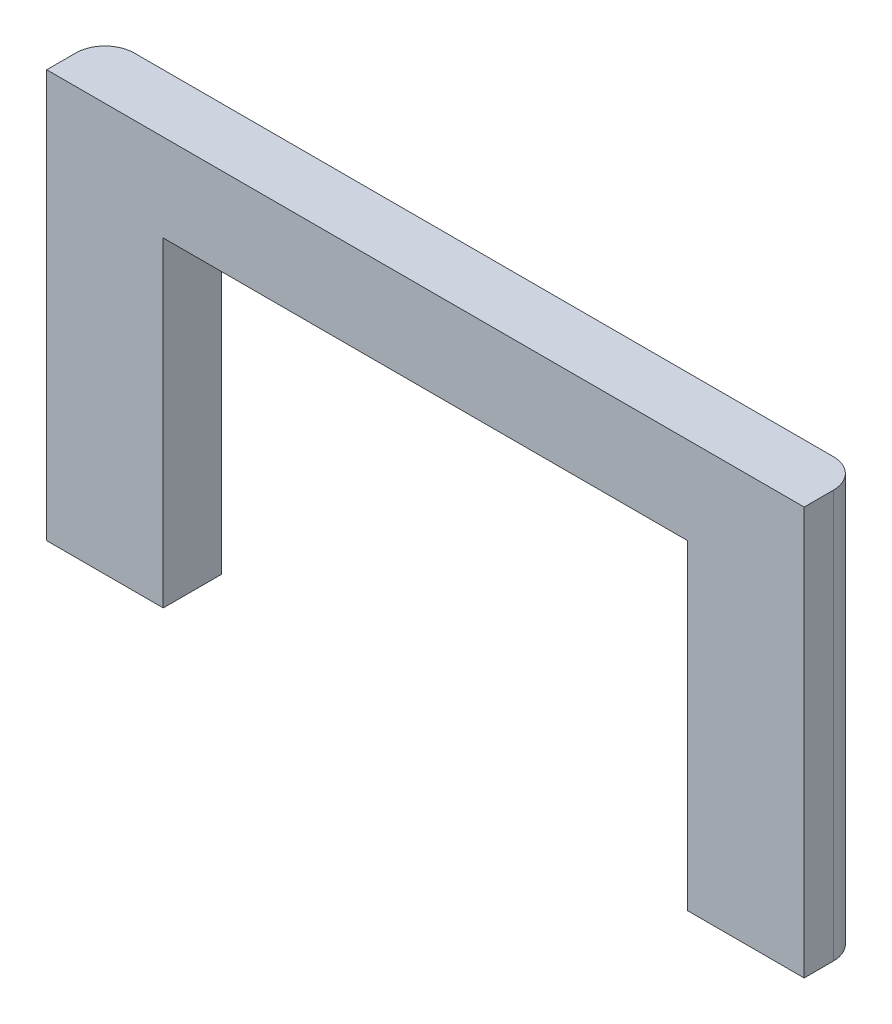
ISO-10303-21;
HEADER;
FILE_DESCRIPTION(('STEP AP214'),'2;1');
FILE_NAME('part.step','',(''),(''),'','','');
FILE_SCHEMA(('AUTOMOTIVE_DESIGN { 1 0 10303 214 1 1 1 1 }'));
ENDSEC;
DATA;
#1=APPLICATION_CONTEXT('core data for automotive mechanical design processes');
#2=APPLICATION_PROTOCOL_DEFINITION('international standard','automotive_design',2000,#1);
#3=PRODUCT_CONTEXT('',#1,'mechanical');
#4=PRODUCT('Part','Part','',(#3));
#5=PRODUCT_RELATED_PRODUCT_CATEGORY('part','',(#4));
#6=PRODUCT_DEFINITION_FORMATION('','',#4);
#7=PRODUCT_DEFINITION_CONTEXT('part definition',#1,'design');
#8=PRODUCT_DEFINITION('design','',#6,#7);
#9=PRODUCT_DEFINITION_SHAPE('','',#8);
#10=(LENGTH_UNIT() NAMED_UNIT(*) SI_UNIT(.MILLI.,.METRE.));
#11=(NAMED_UNIT(*) PLANE_ANGLE_UNIT() SI_UNIT($,.RADIAN.));
#12=(NAMED_UNIT(*) SI_UNIT($,.STERADIAN.) SOLID_ANGLE_UNIT());
#13=UNCERTAINTY_MEASURE_WITH_UNIT(LENGTH_MEASURE(1.E-05),#10,'distance_accuracy_value','');
#14=(GEOMETRIC_REPRESENTATION_CONTEXT(3) GLOBAL_UNCERTAINTY_ASSIGNED_CONTEXT((#13)) GLOBAL_UNIT_ASSIGNED_CONTEXT((#10,
#11,#12)) REPRESENTATION_CONTEXT('',''));
#15=CARTESIAN_POINT('',(0.,0.,0.));
#16=DIRECTION('',(0.,0.,1.));
#17=DIRECTION('',(1.,0.,0.));
#18=AXIS2_PLACEMENT_3D('',#15,#16,#17);
#19=CARTESIAN_POINT('',(-83.3039647577092,29.9118942731278,10.));
#20=DIRECTION('',(1.,0.,0.));
#21=DIRECTION('',(0.,0.,-1.));
#22=AXIS2_PLACEMENT_3D('',#19,#20,#21);
#23=PLANE('',#22);
#24=DIRECTION('',(0.,0.,-1.));
#25=VECTOR('',#24,1.);
#26=CARTESIAN_POINT('',(-83.3039647577092,29.9118942731278,10.));
#27=LINE('',#26,#25);
#28=CARTESIAN_POINT('',(-83.3039647577092,29.9118942731278,10.));
#29=VERTEX_POINT('',#28);
#30=CARTESIAN_POINT('',(-83.3039647577092,29.9118942731278,5.));
#31=VERTEX_POINT('',#30);
#32=EDGE_CURVE('E201',#29,#31,#27,.T.);
#33=ORIENTED_EDGE('',*,*,#32,.T.);
#34=DIRECTION('',(0.,-1.,0.));
#35=VECTOR('',#34,1.);
#36=CARTESIAN_POINT('',(-83.3039647577092,29.9118942731278,5.));
#37=LINE('',#36,#35);
#38=CARTESIAN_POINT('',(-83.3039647577092,-40.0881057268723,5.));
#39=VERTEX_POINT('',#38);
#40=EDGE_CURVE('E48',#31,#39,#37,.T.);
#41=ORIENTED_EDGE('',*,*,#40,.T.);
#42=DIRECTION('',(0.,0.,-1.));
#43=VECTOR('',#42,1.);
#44=CARTESIAN_POINT('',(-83.3039647577092,-40.0881057268723,10.));
#45=LINE('',#44,#43);
#46=CARTESIAN_POINT('',(-83.3039647577092,-40.0881057268723,10.));
#47=VERTEX_POINT('',#46);
#48=EDGE_CURVE('E117',#47,#39,#45,.T.);
#49=ORIENTED_EDGE('',*,*,#48,.F.);
#50=DIRECTION('',(0.,-1.,0.));
#51=VECTOR('',#50,1.);
#52=CARTESIAN_POINT('',(-83.3039647577092,29.9118942731278,10.));
#53=LINE('',#52,#51);
#54=EDGE_CURVE('E124',#29,#47,#53,.T.);
#55=ORIENTED_EDGE('',*,*,#54,.F.);
#56=EDGE_LOOP('',(#33,#41,#49,#55));
#57=FACE_BOUND('',#56,.T.);
#58=ADVANCED_FACE('F39',(#57),#23,.F.);
#59=CARTESIAN_POINT('',(-83.3039647577092,-40.0881057268723,10.));
#60=DIRECTION('',(0.,1.,0.));
#61=DIRECTION('',(0.,0.,1.));
#62=AXIS2_PLACEMENT_3D('',#59,#60,#61);
#63=PLANE('',#62);
#64=ORIENTED_EDGE('',*,*,#48,.T.);
#65=CARTESIAN_POINT('',(-78.3039647577092,-40.0881057268723,5.));
#66=DIRECTION('',(0.,1.,0.));
#67=DIRECTION('',(0.,0.,1.));
#68=AXIS2_PLACEMENT_3D('',#65,#66,#67);
#69=CIRCLE('',#68,5.);
#70=CARTESIAN_POINT('',(-78.3039647577092,-40.0881057268723,0.));
#71=VERTEX_POINT('',#70);
#72=EDGE_CURVE('E11',#39,#71,#69,.F.);
#73=ORIENTED_EDGE('',*,*,#72,.T.);
#74=DIRECTION('',(1.,0.,0.));
#75=VECTOR('',#74,1.);
#76=CARTESIAN_POINT('',(-83.3039647577092,-40.0881057268723,0.));
#77=LINE('',#76,#75);
#78=CARTESIAN_POINT('',(-63.3039647577092,-40.0881057268723,0.));
#79=VERTEX_POINT('',#78);
#80=EDGE_CURVE('E229',#71,#79,#77,.T.);
#81=ORIENTED_EDGE('',*,*,#80,.T.);
#82=DIRECTION('',(0.,0.,-1.));
#83=VECTOR('',#82,1.);
#84=CARTESIAN_POINT('',(-63.3039647577092,-40.0881057268723,10.));
#85=LINE('',#84,#83);
#86=CARTESIAN_POINT('',(-63.3039647577092,-40.0881057268723,10.));
#87=VERTEX_POINT('',#86);
#88=EDGE_CURVE('E119',#87,#79,#85,.T.);
#89=ORIENTED_EDGE('',*,*,#88,.F.);
#90=DIRECTION('',(1.,0.,0.));
#91=VECTOR('',#90,1.);
#92=CARTESIAN_POINT('',(-83.3039647577092,-40.0881057268723,10.));
#93=LINE('',#92,#91);
#94=EDGE_CURVE('E113',#47,#87,#93,.T.);
#95=ORIENTED_EDGE('',*,*,#94,.F.);
#96=EDGE_LOOP('',(#64,#73,#81,#89,#95));
#97=FACE_BOUND('',#96,.T.);
#98=ADVANCED_FACE('F115',(#97),#63,.F.);
#99=CARTESIAN_POINT('',(-63.3039647577092,14.9118942731278,10.));
#100=DIRECTION('',(-1.,0.,0.));
#101=DIRECTION('',(0.,-1.,0.));
#102=AXIS2_PLACEMENT_3D('',#99,#100,#101);
#103=PLANE('',#102);
#104=DIRECTION('',(0.,1.,0.));
#105=VECTOR('',#104,1.);
#106=CARTESIAN_POINT('',(-63.3039647577092,14.9118942731278,0.));
#107=LINE('',#106,#105);
#108=CARTESIAN_POINT('',(-63.3039647577092,14.9118942731278,0.));
#109=VERTEX_POINT('',#108);
#110=EDGE_CURVE('E224',#79,#109,#107,.T.);
#111=ORIENTED_EDGE('',*,*,#110,.T.);
#112=DIRECTION('',(0.,0.,-1.));
#113=VECTOR('',#112,1.);
#114=CARTESIAN_POINT('',(-63.3039647577092,14.9118942731278,10.));
#115=LINE('',#114,#113);
#116=CARTESIAN_POINT('',(-63.3039647577092,14.9118942731278,10.));
#117=VERTEX_POINT('',#116);
#118=EDGE_CURVE('E144',#117,#109,#115,.T.);
#119=ORIENTED_EDGE('',*,*,#118,.F.);
#120=DIRECTION('',(0.,1.,0.));
#121=VECTOR('',#120,1.);
#122=CARTESIAN_POINT('',(-63.3039647577092,14.9118942731278,10.));
#123=LINE('',#122,#121);
#124=EDGE_CURVE('E123',#87,#117,#123,.T.);
#125=ORIENTED_EDGE('',*,*,#124,.F.);
#126=ORIENTED_EDGE('',*,*,#88,.T.);
#127=EDGE_LOOP('',(#111,#119,#125,#126));
#128=FACE_BOUND('',#127,.T.);
#129=ADVANCED_FACE('F247',(#128),#103,.F.);
#130=CARTESIAN_POINT('',(-63.3039647577092,14.9118942731278,10.));
#131=DIRECTION('',(0.,1.,0.));
#132=DIRECTION('',(0.,0.,1.));
#133=AXIS2_PLACEMENT_3D('',#130,#131,#132);
#134=PLANE('',#133);
#135=DIRECTION('',(1.,0.,0.));
#136=VECTOR('',#135,1.);
#137=CARTESIAN_POINT('',(-63.3039647577092,14.9118942731278,0.));
#138=LINE('',#137,#136);
#139=CARTESIAN_POINT('',(26.6960352422908,14.9118942731278,0.));
#140=VERTEX_POINT('',#139);
#141=EDGE_CURVE('E219',#109,#140,#138,.T.);
#142=ORIENTED_EDGE('',*,*,#141,.T.);
#143=DIRECTION('',(0.,0.,-1.));
#144=VECTOR('',#143,1.);
#145=CARTESIAN_POINT('',(26.6960352422908,14.9118942731278,10.));
#146=LINE('',#145,#144);
#147=CARTESIAN_POINT('',(26.6960352422908,14.9118942731278,10.));
#148=VERTEX_POINT('',#147);
#149=EDGE_CURVE('E208',#148,#140,#146,.T.);
#150=ORIENTED_EDGE('',*,*,#149,.F.);
#151=DIRECTION('',(1.,0.,0.));
#152=VECTOR('',#151,1.);
#153=CARTESIAN_POINT('',(-63.3039647577092,14.9118942731278,10.));
#154=LINE('',#153,#152);
#155=EDGE_CURVE('E220',#117,#148,#154,.T.);
#156=ORIENTED_EDGE('',*,*,#155,.F.);
#157=ORIENTED_EDGE('',*,*,#118,.T.);
#158=EDGE_LOOP('',(#142,#150,#156,#157));
#159=FACE_BOUND('',#158,.T.);
#160=ADVANCED_FACE('F217',(#159),#134,.F.);
#161=CARTESIAN_POINT('',(26.6960352422908,14.9118942731278,10.));
#162=DIRECTION('',(1.,0.,0.));
#163=DIRECTION('',(0.,0.,-1.));
#164=AXIS2_PLACEMENT_3D('',#161,#162,#163);
#165=PLANE('',#164);
#166=DIRECTION('',(0.,-1.,0.));
#167=VECTOR('',#166,1.);
#168=CARTESIAN_POINT('',(26.6960352422908,14.9118942731278,0.));
#169=LINE('',#168,#167);
#170=CARTESIAN_POINT('',(26.6960352422908,-40.0881057268723,0.));
#171=VERTEX_POINT('',#170);
#172=EDGE_CURVE('E197',#140,#171,#169,.T.);
#173=ORIENTED_EDGE('',*,*,#172,.T.);
#174=DIRECTION('',(0.,0.,-1.));
#175=VECTOR('',#174,1.);
#176=CARTESIAN_POINT('',(26.6960352422908,-40.0881057268723,10.));
#177=LINE('',#176,#175);
#178=CARTESIAN_POINT('',(26.6960352422908,-40.0881057268723,10.));
#179=VERTEX_POINT('',#178);
#180=EDGE_CURVE('E183',#179,#171,#177,.T.);
#181=ORIENTED_EDGE('',*,*,#180,.F.);
#182=DIRECTION('',(0.,-1.,0.));
#183=VECTOR('',#182,1.);
#184=CARTESIAN_POINT('',(26.6960352422908,14.9118942731278,10.));
#185=LINE('',#184,#183);
#186=EDGE_CURVE('E241',#148,#179,#185,.T.);
#187=ORIENTED_EDGE('',*,*,#186,.F.);
#188=ORIENTED_EDGE('',*,*,#149,.T.);
#189=EDGE_LOOP('',(#173,#181,#187,#188));
#190=FACE_BOUND('',#189,.T.);
#191=ADVANCED_FACE('F254',(#190),#165,.F.);
#192=CARTESIAN_POINT('',(26.6960352422908,-40.0881057268723,10.));
#193=DIRECTION('',(0.,1.,0.));
#194=DIRECTION('',(0.,0.,1.));
#195=AXIS2_PLACEMENT_3D('',#192,#193,#194);
#196=PLANE('',#195);
#197=DIRECTION('',(1.,0.,0.));
#198=VECTOR('',#197,1.);
#199=CARTESIAN_POINT('',(26.6960352422908,-40.0881057268723,0.));
#200=LINE('',#199,#198);
#201=CARTESIAN_POINT('',(41.6960352422908,-40.0881057268723,0.));
#202=VERTEX_POINT('',#201);
#203=EDGE_CURVE('E173',#171,#202,#200,.T.);
#204=ORIENTED_EDGE('',*,*,#203,.T.);
#205=CARTESIAN_POINT('',(41.6960352422908,-40.0881057268723,5.));
#206=DIRECTION('',(0.,1.,0.));
#207=DIRECTION('',(0.,0.,1.));
#208=AXIS2_PLACEMENT_3D('',#205,#206,#207);
#209=CIRCLE('',#208,5.);
#210=CARTESIAN_POINT('',(46.6960352422908,-40.0881057268723,5.));
#211=VERTEX_POINT('',#210);
#212=EDGE_CURVE('E159',#202,#211,#209,.F.);
#213=ORIENTED_EDGE('',*,*,#212,.T.);
#214=DIRECTION('',(0.,0.,-1.));
#215=VECTOR('',#214,1.);
#216=CARTESIAN_POINT('',(46.6960352422908,-40.0881057268723,10.));
#217=LINE('',#216,#215);
#218=CARTESIAN_POINT('',(46.6960352422908,-40.0881057268723,10.));
#219=VERTEX_POINT('',#218);
#220=EDGE_CURVE('E169',#219,#211,#217,.T.);
#221=ORIENTED_EDGE('',*,*,#220,.F.);
#222=DIRECTION('',(1.,0.,0.));
#223=VECTOR('',#222,1.);
#224=CARTESIAN_POINT('',(26.6960352422908,-40.0881057268723,10.));
#225=LINE('',#224,#223);
#226=EDGE_CURVE('E238',#179,#219,#225,.T.);
#227=ORIENTED_EDGE('',*,*,#226,.F.);
#228=ORIENTED_EDGE('',*,*,#180,.T.);
#229=EDGE_LOOP('',(#204,#213,#221,#227,#228));
#230=FACE_BOUND('',#229,.T.);
#231=ADVANCED_FACE('F167',(#230),#196,.F.);
#232=CARTESIAN_POINT('',(46.6960352422908,29.9118942731278,10.));
#233=DIRECTION('',(-1.,0.,0.));
#234=DIRECTION('',(0.,-1.,0.));
#235=AXIS2_PLACEMENT_3D('',#232,#233,#234);
#236=PLANE('',#235);
#237=ORIENTED_EDGE('',*,*,#220,.T.);
#238=DIRECTION('',(0.,1.,0.));
#239=VECTOR('',#238,1.);
#240=CARTESIAN_POINT('',(46.6960352422908,29.9118942731278,5.));
#241=LINE('',#240,#239);
#242=CARTESIAN_POINT('',(46.6960352422908,29.9118942731278,5.));
#243=VERTEX_POINT('',#242);
#244=EDGE_CURVE('E137',#211,#243,#241,.T.);
#245=ORIENTED_EDGE('',*,*,#244,.T.);
#246=DIRECTION('',(0.,0.,-1.));
#247=VECTOR('',#246,1.);
#248=CARTESIAN_POINT('',(46.6960352422908,29.9118942731278,10.));
#249=LINE('',#248,#247);
#250=CARTESIAN_POINT('',(46.6960352422908,29.9118942731278,10.));
#251=VERTEX_POINT('',#250);
#252=EDGE_CURVE('E184',#251,#243,#249,.T.);
#253=ORIENTED_EDGE('',*,*,#252,.F.);
#254=DIRECTION('',(0.,1.,0.));
#255=VECTOR('',#254,1.);
#256=CARTESIAN_POINT('',(46.6960352422908,29.9118942731278,10.));
#257=LINE('',#256,#255);
#258=EDGE_CURVE('E181',#219,#251,#257,.T.);
#259=ORIENTED_EDGE('',*,*,#258,.F.);
#260=EDGE_LOOP('',(#237,#245,#253,#259));
#261=FACE_BOUND('',#260,.T.);
#262=ADVANCED_FACE('F178',(#261),#236,.F.);
#263=CARTESIAN_POINT('',(-83.3039647577092,29.9118942731278,10.));
#264=DIRECTION('',(0.,-1.,0.));
#265=DIRECTION('',(0.,0.,-1.));
#266=AXIS2_PLACEMENT_3D('',#263,#264,#265);
#267=PLANE('',#266);
#268=ORIENTED_EDGE('',*,*,#252,.T.);
#269=CARTESIAN_POINT('',(41.6960352422908,29.9118942731278,5.));
#270=DIRECTION('',(0.,-1.,0.));
#271=DIRECTION('',(0.,0.,-1.));
#272=AXIS2_PLACEMENT_3D('',#269,#270,#271);
#273=CIRCLE('',#272,5.);
#274=CARTESIAN_POINT('',(41.6960352422908,29.9118942731278,0.));
#275=VERTEX_POINT('',#274);
#276=EDGE_CURVE('E150',#243,#275,#273,.F.);
#277=ORIENTED_EDGE('',*,*,#276,.T.);
#278=DIRECTION('',(-1.,0.,0.));
#279=VECTOR('',#278,1.);
#280=CARTESIAN_POINT('',(-83.3039647577092,29.9118942731278,0.));
#281=LINE('',#280,#279);
#282=CARTESIAN_POINT('',(-78.3039647577092,29.9118942731278,0.));
#283=VERTEX_POINT('',#282);
#284=EDGE_CURVE('E134',#275,#283,#281,.T.);
#285=ORIENTED_EDGE('',*,*,#284,.T.);
#286=CARTESIAN_POINT('',(-78.3039647577092,29.9118942731278,5.));
#287=DIRECTION('',(0.,-1.,0.));
#288=DIRECTION('',(0.,0.,-1.));
#289=AXIS2_PLACEMENT_3D('',#286,#287,#288);
#290=CIRCLE('',#289,5.);
#291=EDGE_CURVE('E142',#283,#31,#290,.F.);
#292=ORIENTED_EDGE('',*,*,#291,.T.);
#293=ORIENTED_EDGE('',*,*,#32,.F.);
#294=DIRECTION('',(-1.,0.,0.));
#295=VECTOR('',#294,1.);
#296=CARTESIAN_POINT('',(-83.3039647577092,29.9118942731278,10.));
#297=LINE('',#296,#295);
#298=EDGE_CURVE('E129',#251,#29,#297,.T.);
#299=ORIENTED_EDGE('',*,*,#298,.F.);
#300=EDGE_LOOP('',(#268,#277,#285,#292,#293,#299));
#301=FACE_BOUND('',#300,.T.);
#302=ADVANCED_FACE('F190',(#301),#267,.F.);
#303=CARTESIAN_POINT('',(0.,0.,10.));
#304=DIRECTION('',(0.,0.,1.));
#305=DIRECTION('',(1.,0.,0.));
#306=AXIS2_PLACEMENT_3D('',#303,#304,#305);
#307=PLANE('',#306);
#308=ORIENTED_EDGE('',*,*,#54,.T.);
#309=ORIENTED_EDGE('',*,*,#94,.T.);
#310=ORIENTED_EDGE('',*,*,#124,.T.);
#311=ORIENTED_EDGE('',*,*,#155,.T.);
#312=ORIENTED_EDGE('',*,*,#186,.T.);
#313=ORIENTED_EDGE('',*,*,#226,.T.);
#314=ORIENTED_EDGE('',*,*,#258,.T.);
#315=ORIENTED_EDGE('',*,*,#298,.T.);
#316=EDGE_LOOP('',(#308,#309,#310,#311,#312,#313,#314,#315));
#317=FACE_BOUND('',#316,.T.);
#318=ADVANCED_FACE('F127',(#317),#307,.T.);
#319=CARTESIAN_POINT('',(0.,0.,0.));
#320=DIRECTION('',(0.,0.,1.));
#321=DIRECTION('',(1.,0.,0.));
#322=AXIS2_PLACEMENT_3D('',#319,#320,#321);
#323=PLANE('',#322);
#324=ORIENTED_EDGE('',*,*,#284,.F.);
#325=DIRECTION('',(0.,1.,0.));
#326=VECTOR('',#325,1.);
#327=CARTESIAN_POINT('',(41.6960352422908,0.,0.));
#328=LINE('',#327,#326);
#329=EDGE_CURVE('E156',#275,#202,#328,.F.);
#330=ORIENTED_EDGE('',*,*,#329,.T.);
#331=ORIENTED_EDGE('',*,*,#203,.F.);
#332=ORIENTED_EDGE('',*,*,#172,.F.);
#333=ORIENTED_EDGE('',*,*,#141,.F.);
#334=ORIENTED_EDGE('',*,*,#110,.F.);
#335=ORIENTED_EDGE('',*,*,#80,.F.);
#336=DIRECTION('',(0.,-1.,0.));
#337=VECTOR('',#336,1.);
#338=CARTESIAN_POINT('',(-78.3039647577092,0.,0.));
#339=LINE('',#338,#337);
#340=EDGE_CURVE('E153',#71,#283,#339,.F.);
#341=ORIENTED_EDGE('',*,*,#340,.T.);
#342=EDGE_LOOP('',(#324,#330,#331,#332,#333,#334,#335,#341));
#343=FACE_BOUND('',#342,.T.);
#344=ADVANCED_FACE('F193',(#343),#323,.F.);
#345=CARTESIAN_POINT('',(41.6960352422908,29.9118942731278,5.));
#346=DIRECTION('',(0.,1.,0.));
#347=DIRECTION('',(-1.,0.,0.));
#348=AXIS2_PLACEMENT_3D('',#345,#346,#347);
#349=CYLINDRICAL_SURFACE('',#348,5.);
#350=ORIENTED_EDGE('',*,*,#212,.F.);
#351=ORIENTED_EDGE('',*,*,#329,.F.);
#352=ORIENTED_EDGE('',*,*,#276,.F.);
#353=ORIENTED_EDGE('',*,*,#244,.F.);
#354=EDGE_LOOP('',(#350,#351,#352,#353));
#355=FACE_BOUND('',#354,.T.);
#356=ADVANCED_FACE('F186',(#355),#349,.T.);
#357=CARTESIAN_POINT('',(-78.3039647577092,29.9118942731278,5.));
#358=DIRECTION('',(0.,-1.,0.));
#359=DIRECTION('',(0.,0.,-1.));
#360=AXIS2_PLACEMENT_3D('',#357,#358,#359);
#361=CYLINDRICAL_SURFACE('',#360,5.);
#362=ORIENTED_EDGE('',*,*,#291,.F.);
#363=ORIENTED_EDGE('',*,*,#340,.F.);
#364=ORIENTED_EDGE('',*,*,#72,.F.);
#365=ORIENTED_EDGE('',*,*,#40,.F.);
#366=EDGE_LOOP('',(#362,#363,#364,#365));
#367=FACE_BOUND('',#366,.T.);
#368=ADVANCED_FACE('F41',(#367),#361,.T.);
#369=CLOSED_SHELL('',(#58,#98,#129,#160,#191,#231,#262,#302,#318,#344,#356,#368));
#370=MANIFOLD_SOLID_BREP('B2',#369);
#371=ADVANCED_BREP_SHAPE_REPRESENTATION('',(#18,#370),#14);
#372=SHAPE_DEFINITION_REPRESENTATION(#9,#371);
ENDSEC;
END-ISO-10303-21;
